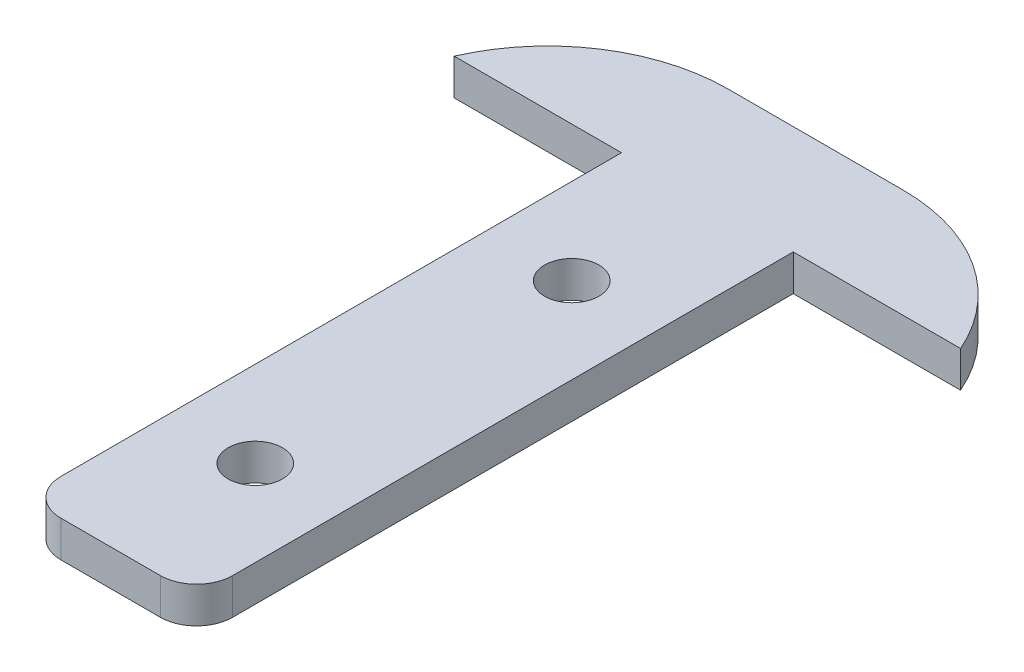
ISO-10303-21;
HEADER;
FILE_DESCRIPTION(('STEP AP214'),'2;1');
FILE_NAME('part.step','',(''),(''),'','','');
FILE_SCHEMA(('AUTOMOTIVE_DESIGN { 1 0 10303 214 1 1 1 1 }'));
ENDSEC;
DATA;
#1=APPLICATION_CONTEXT('core data for automotive mechanical design processes');
#2=APPLICATION_PROTOCOL_DEFINITION('international standard','automotive_design',2000,#1);
#3=PRODUCT_CONTEXT('',#1,'mechanical');
#4=PRODUCT('Part','Part','',(#3));
#5=PRODUCT_RELATED_PRODUCT_CATEGORY('part','',(#4));
#6=PRODUCT_DEFINITION_FORMATION('','',#4);
#7=PRODUCT_DEFINITION_CONTEXT('part definition',#1,'design');
#8=PRODUCT_DEFINITION('design','',#6,#7);
#9=PRODUCT_DEFINITION_SHAPE('','',#8);
#10=(LENGTH_UNIT() NAMED_UNIT(*) SI_UNIT(.MILLI.,.METRE.));
#11=(NAMED_UNIT(*) PLANE_ANGLE_UNIT() SI_UNIT($,.RADIAN.));
#12=(NAMED_UNIT(*) SI_UNIT($,.STERADIAN.) SOLID_ANGLE_UNIT());
#13=UNCERTAINTY_MEASURE_WITH_UNIT(LENGTH_MEASURE(1.E-05),#10,'distance_accuracy_value','');
#14=(GEOMETRIC_REPRESENTATION_CONTEXT(3) GLOBAL_UNCERTAINTY_ASSIGNED_CONTEXT((#13)) GLOBAL_UNIT_ASSIGNED_CONTEXT((#10,
#11,#12)) REPRESENTATION_CONTEXT('',''));
#15=CARTESIAN_POINT('',(0.,0.,0.));
#16=DIRECTION('',(0.,0.,1.));
#17=DIRECTION('',(1.,0.,0.));
#18=AXIS2_PLACEMENT_3D('',#15,#16,#17);
#19=CARTESIAN_POINT('',(0.,2.,-16.5));
#20=DIRECTION('',(0.,0.,-1.));
#21=DIRECTION('',(-1.,0.,0.));
#22=AXIS2_PLACEMENT_3D('',#19,#20,#21);
#23=PLANE('',#22);
#24=DIRECTION('',(1.,0.,0.));
#25=VECTOR('',#24,1.);
#26=CARTESIAN_POINT('',(0.,0.,-16.5));
#27=LINE('',#26,#25);
#28=CARTESIAN_POINT('',(-14.,0.,-16.5));
#29=VERTEX_POINT('',#28);
#30=CARTESIAN_POINT('',(-4.75,0.,-16.5));
#31=VERTEX_POINT('',#30);
#32=EDGE_CURVE('E140',#29,#31,#27,.T.);
#33=ORIENTED_EDGE('',*,*,#32,.T.);
#34=DIRECTION('',(0.,-1.,0.));
#35=VECTOR('',#34,1.);
#36=CARTESIAN_POINT('',(-4.75,2.,-16.5));
#37=LINE('',#36,#35);
#38=CARTESIAN_POINT('',(-4.75,2.,-16.5));
#39=VERTEX_POINT('',#38);
#40=EDGE_CURVE('E121',#39,#31,#37,.T.);
#41=ORIENTED_EDGE('',*,*,#40,.F.);
#42=DIRECTION('',(1.,0.,0.));
#43=VECTOR('',#42,1.);
#44=CARTESIAN_POINT('',(0.,2.,-16.5));
#45=LINE('',#44,#43);
#46=CARTESIAN_POINT('',(-14.,2.,-16.5));
#47=VERTEX_POINT('',#46);
#48=EDGE_CURVE('E125',#47,#39,#45,.T.);
#49=ORIENTED_EDGE('',*,*,#48,.F.);
#50=DIRECTION('',(0.,-1.,0.));
#51=VECTOR('',#50,1.);
#52=CARTESIAN_POINT('',(-14.,2.,-16.5));
#53=LINE('',#52,#51);
#54=EDGE_CURVE('E224',#47,#29,#53,.T.);
#55=ORIENTED_EDGE('',*,*,#54,.T.);
#56=EDGE_LOOP('',(#33,#41,#49,#55));
#57=FACE_BOUND('',#56,.T.);
#58=ADVANCED_FACE('F41',(#57),#23,.F.);
#59=CARTESIAN_POINT('',(-4.75,2.,0.));
#60=DIRECTION('',(-1.,0.,0.));
#61=DIRECTION('',(0.,0.,1.));
#62=AXIS2_PLACEMENT_3D('',#59,#60,#61);
#63=PLANE('',#62);
#64=DIRECTION('',(0.,0.,-1.));
#65=VECTOR('',#64,1.);
#66=CARTESIAN_POINT('',(-4.75,0.,0.));
#67=LINE('',#66,#65);
#68=CARTESIAN_POINT('',(-4.75,0.,14.5));
#69=VERTEX_POINT('',#68);
#70=EDGE_CURVE('E213',#69,#31,#67,.T.);
#71=ORIENTED_EDGE('',*,*,#70,.F.);
#72=DIRECTION('',(0.,-1.,0.));
#73=VECTOR('',#72,1.);
#74=CARTESIAN_POINT('',(-4.75,2.,14.5));
#75=LINE('',#74,#73);
#76=CARTESIAN_POINT('',(-4.75,2.,14.5));
#77=VERTEX_POINT('',#76);
#78=EDGE_CURVE('E11',#69,#77,#75,.F.);
#79=ORIENTED_EDGE('',*,*,#78,.T.);
#80=DIRECTION('',(0.,0.,-1.));
#81=VECTOR('',#80,1.);
#82=CARTESIAN_POINT('',(-4.75,2.,0.));
#83=LINE('',#82,#81);
#84=EDGE_CURVE('E117',#77,#39,#83,.T.);
#85=ORIENTED_EDGE('',*,*,#84,.T.);
#86=ORIENTED_EDGE('',*,*,#40,.T.);
#87=EDGE_LOOP('',(#71,#79,#85,#86));
#88=FACE_BOUND('',#87,.T.);
#89=ADVANCED_FACE('F119',(#88),#63,.T.);
#90=CARTESIAN_POINT('',(0.,2.,16.5));
#91=DIRECTION('',(0.,0.,1.));
#92=DIRECTION('',(1.,0.,0.));
#93=AXIS2_PLACEMENT_3D('',#90,#91,#92);
#94=PLANE('',#93);
#95=DIRECTION('',(-1.,0.,0.));
#96=VECTOR('',#95,1.);
#97=CARTESIAN_POINT('',(0.,0.,16.5));
#98=LINE('',#97,#96);
#99=CARTESIAN_POINT('',(2.75,0.,16.5));
#100=VERTEX_POINT('',#99);
#101=CARTESIAN_POINT('',(-2.75,0.,16.5));
#102=VERTEX_POINT('',#101);
#103=EDGE_CURVE('E206',#100,#102,#98,.T.);
#104=ORIENTED_EDGE('',*,*,#103,.F.);
#105=DIRECTION('',(0.,-1.,0.));
#106=VECTOR('',#105,1.);
#107=CARTESIAN_POINT('',(2.75,2.,16.5));
#108=LINE('',#107,#106);
#109=CARTESIAN_POINT('',(2.75,2.,16.5));
#110=VERTEX_POINT('',#109);
#111=EDGE_CURVE('E183',#100,#110,#108,.F.);
#112=ORIENTED_EDGE('',*,*,#111,.T.);
#113=DIRECTION('',(-1.,0.,0.));
#114=VECTOR('',#113,1.);
#115=CARTESIAN_POINT('',(0.,2.,16.5));
#116=LINE('',#115,#114);
#117=CARTESIAN_POINT('',(-2.75,2.,16.5));
#118=VERTEX_POINT('',#117);
#119=EDGE_CURVE('E124',#110,#118,#116,.T.);
#120=ORIENTED_EDGE('',*,*,#119,.T.);
#121=DIRECTION('',(0.,-1.,0.));
#122=VECTOR('',#121,1.);
#123=CARTESIAN_POINT('',(-2.75,2.,16.5));
#124=LINE('',#123,#122);
#125=EDGE_CURVE('E179',#118,#102,#124,.T.);
#126=ORIENTED_EDGE('',*,*,#125,.T.);
#127=EDGE_LOOP('',(#104,#112,#120,#126));
#128=FACE_BOUND('',#127,.T.);
#129=ADVANCED_FACE('F210',(#128),#94,.T.);
#130=CARTESIAN_POINT('',(4.75,2.,0.));
#131=DIRECTION('',(-1.,0.,0.));
#132=DIRECTION('',(0.,0.,1.));
#133=AXIS2_PLACEMENT_3D('',#130,#131,#132);
#134=PLANE('',#133);
#135=DIRECTION('',(0.,0.,-1.));
#136=VECTOR('',#135,1.);
#137=CARTESIAN_POINT('',(4.75,2.,0.));
#138=LINE('',#137,#136);
#139=CARTESIAN_POINT('',(4.75,2.,14.5));
#140=VERTEX_POINT('',#139);
#141=CARTESIAN_POINT('',(4.75,2.,-16.5));
#142=VERTEX_POINT('',#141);
#143=EDGE_CURVE('E190',#140,#142,#138,.T.);
#144=ORIENTED_EDGE('',*,*,#143,.F.);
#145=DIRECTION('',(0.,-1.,0.));
#146=VECTOR('',#145,1.);
#147=CARTESIAN_POINT('',(4.75,0.,14.5));
#148=LINE('',#147,#146);
#149=CARTESIAN_POINT('',(4.75,0.,14.5));
#150=VERTEX_POINT('',#149);
#151=EDGE_CURVE('E169',#140,#150,#148,.T.);
#152=ORIENTED_EDGE('',*,*,#151,.T.);
#153=DIRECTION('',(0.,0.,-1.));
#154=VECTOR('',#153,1.);
#155=CARTESIAN_POINT('',(4.75,0.,0.));
#156=LINE('',#155,#154);
#157=CARTESIAN_POINT('',(4.75,0.,-16.5));
#158=VERTEX_POINT('',#157);
#159=EDGE_CURVE('E208',#150,#158,#156,.T.);
#160=ORIENTED_EDGE('',*,*,#159,.T.);
#161=DIRECTION('',(0.,-1.,0.));
#162=VECTOR('',#161,1.);
#163=CARTESIAN_POINT('',(4.75,2.,-16.5));
#164=LINE('',#163,#162);
#165=EDGE_CURVE('E143',#142,#158,#164,.T.);
#166=ORIENTED_EDGE('',*,*,#165,.F.);
#167=EDGE_LOOP('',(#144,#152,#160,#166));
#168=FACE_BOUND('',#167,.T.);
#169=ADVANCED_FACE('F196',(#168),#134,.F.);
#170=CARTESIAN_POINT('',(14.,0.,-16.5));
#171=VERTEX_POINT('',#170);
#172=EDGE_CURVE('E217',#158,#171,#27,.T.);
#173=ORIENTED_EDGE('',*,*,#172,.T.);
#174=DIRECTION('',(0.,-1.,0.));
#175=VECTOR('',#174,1.);
#176=CARTESIAN_POINT('',(14.,2.,-16.5));
#177=LINE('',#176,#175);
#178=CARTESIAN_POINT('',(14.,2.,-16.5));
#179=VERTEX_POINT('',#178);
#180=EDGE_CURVE('E151',#179,#171,#177,.T.);
#181=ORIENTED_EDGE('',*,*,#180,.F.);
#182=EDGE_CURVE('E138',#142,#179,#45,.T.);
#183=ORIENTED_EDGE('',*,*,#182,.F.);
#184=ORIENTED_EDGE('',*,*,#165,.T.);
#185=EDGE_LOOP('',(#173,#181,#183,#184));
#186=FACE_BOUND('',#185,.T.);
#187=ADVANCED_FACE('F237',(#186),#23,.F.);
#188=CARTESIAN_POINT('',(0.,2.,-22.5));
#189=DIRECTION('',(0.,0.,-1.));
#190=DIRECTION('',(-1.,0.,0.));
#191=AXIS2_PLACEMENT_3D('',#188,#189,#190);
#192=PLANE('',#191);
#193=DIRECTION('',(1.,0.,0.));
#194=VECTOR('',#193,1.);
#195=CARTESIAN_POINT('',(0.,0.,-22.5));
#196=LINE('',#195,#194);
#197=CARTESIAN_POINT('',(-4.83484861008832,0.,-22.5));
#198=VERTEX_POINT('',#197);
#199=CARTESIAN_POINT('',(4.83484861008832,0.,-22.5));
#200=VERTEX_POINT('',#199);
#201=EDGE_CURVE('E136',#198,#200,#196,.T.);
#202=ORIENTED_EDGE('',*,*,#201,.F.);
#203=DIRECTION('',(0.,1.,0.));
#204=VECTOR('',#203,1.);
#205=CARTESIAN_POINT('',(-4.83484861008832,2.,-22.5));
#206=LINE('',#205,#204);
#207=CARTESIAN_POINT('',(-4.83484861008832,2.,-22.5));
#208=VERTEX_POINT('',#207);
#209=EDGE_CURVE('E164',#198,#208,#206,.T.);
#210=ORIENTED_EDGE('',*,*,#209,.T.);
#211=DIRECTION('',(1.,0.,0.));
#212=VECTOR('',#211,1.);
#213=CARTESIAN_POINT('',(0.,2.,-22.5));
#214=LINE('',#213,#212);
#215=CARTESIAN_POINT('',(4.83484861008832,2.,-22.5));
#216=VERTEX_POINT('',#215);
#217=EDGE_CURVE('E226',#208,#216,#214,.T.);
#218=ORIENTED_EDGE('',*,*,#217,.T.);
#219=DIRECTION('',(0.,1.,0.));
#220=VECTOR('',#219,1.);
#221=CARTESIAN_POINT('',(4.83484861008832,0.,-22.5));
#222=LINE('',#221,#220);
#223=EDGE_CURVE('E142',#216,#200,#222,.F.);
#224=ORIENTED_EDGE('',*,*,#223,.T.);
#225=EDGE_LOOP('',(#202,#210,#218,#224));
#226=FACE_BOUND('',#225,.T.);
#227=ADVANCED_FACE('F265',(#226),#192,.T.);
#228=CARTESIAN_POINT('',(0.,2.,0.));
#229=DIRECTION('',(0.,1.,0.));
#230=DIRECTION('',(0.,0.,1.));
#231=AXIS2_PLACEMENT_3D('',#228,#229,#230);
#232=PLANE('',#231);
#233=CARTESIAN_POINT('',(0.,2.,8.49999999999999));
#234=DIRECTION('',(0.,-1.,0.));
#235=DIRECTION('',(0.,0.,-1.));
#236=AXIS2_PLACEMENT_3D('',#233,#234,#235);
#237=CIRCLE('',#236,1.5);
#238=CARTESIAN_POINT('',(0.,2.,6.99999999999999));
#239=VERTEX_POINT('',#238);
#240=EDGE_CURVE('E241',#239,#239,#237,.T.);
#241=ORIENTED_EDGE('',*,*,#240,.T.);
#242=EDGE_LOOP('',(#241));
#243=FACE_BOUND('',#242,.T.);
#244=CARTESIAN_POINT('',(0.,2.,-9.00000000000001));
#245=DIRECTION('',(0.,-1.,0.));
#246=DIRECTION('',(0.,0.,-1.));
#247=AXIS2_PLACEMENT_3D('',#244,#245,#246);
#248=CIRCLE('',#247,1.5);
#249=CARTESIAN_POINT('',(0.,2.,-10.5));
#250=VERTEX_POINT('',#249);
#251=EDGE_CURVE('E250',#250,#250,#248,.T.);
#252=ORIENTED_EDGE('',*,*,#251,.T.);
#253=EDGE_LOOP('',(#252));
#254=FACE_BOUND('',#253,.T.);
#255=ORIENTED_EDGE('',*,*,#119,.F.);
#256=CARTESIAN_POINT('',(2.75,2.,14.5));
#257=DIRECTION('',(0.,1.,0.));
#258=DIRECTION('',(0.,0.,1.));
#259=AXIS2_PLACEMENT_3D('',#256,#257,#258);
#260=CIRCLE('',#259,2.);
#261=EDGE_CURVE('E50',#110,#140,#260,.T.);
#262=ORIENTED_EDGE('',*,*,#261,.T.);
#263=ORIENTED_EDGE('',*,*,#143,.T.);
#264=ORIENTED_EDGE('',*,*,#182,.T.);
#265=CARTESIAN_POINT('',(4.83484861008832,2.,-12.5));
#266=DIRECTION('',(0.,1.,0.));
#267=DIRECTION('',(0.,0.,1.));
#268=AXIS2_PLACEMENT_3D('',#265,#266,#267);
#269=CIRCLE('',#268,10.);
#270=EDGE_CURVE('E157',#179,#216,#269,.T.);
#271=ORIENTED_EDGE('',*,*,#270,.T.);
#272=ORIENTED_EDGE('',*,*,#217,.F.);
#273=CARTESIAN_POINT('',(-4.83484861008832,2.,-12.5));
#274=DIRECTION('',(0.,1.,0.));
#275=DIRECTION('',(0.,0.,1.));
#276=AXIS2_PLACEMENT_3D('',#273,#274,#275);
#277=CIRCLE('',#276,10.);
#278=EDGE_CURVE('E131',#208,#47,#277,.T.);
#279=ORIENTED_EDGE('',*,*,#278,.T.);
#280=ORIENTED_EDGE('',*,*,#48,.T.);
#281=ORIENTED_EDGE('',*,*,#84,.F.);
#282=CARTESIAN_POINT('',(-2.75,2.,14.5));
#283=DIRECTION('',(0.,1.,0.));
#284=DIRECTION('',(0.,0.,1.));
#285=AXIS2_PLACEMENT_3D('',#282,#283,#284);
#286=CIRCLE('',#285,2.);
#287=EDGE_CURVE('E62',#77,#118,#286,.T.);
#288=ORIENTED_EDGE('',*,*,#287,.T.);
#289=EDGE_LOOP('',(#255,#262,#263,#264,#271,#272,#279,#280,#281,#288));
#290=FACE_BOUND('',#289,.T.);
#291=ADVANCED_FACE('F128',(#243,#254,#290),#232,.T.);
#292=CARTESIAN_POINT('',(0.,0.,0.));
#293=DIRECTION('',(0.,1.,0.));
#294=DIRECTION('',(0.,0.,1.));
#295=AXIS2_PLACEMENT_3D('',#292,#293,#294);
#296=PLANE('',#295);
#297=CARTESIAN_POINT('',(0.,0.,8.49999999999999));
#298=DIRECTION('',(0.,-1.,0.));
#299=DIRECTION('',(0.,0.,-1.));
#300=AXIS2_PLACEMENT_3D('',#297,#298,#299);
#301=CIRCLE('',#300,1.5);
#302=CARTESIAN_POINT('',(0.,0.,6.99999999999999));
#303=VERTEX_POINT('',#302);
#304=EDGE_CURVE('E244',#303,#303,#301,.T.);
#305=ORIENTED_EDGE('',*,*,#304,.F.);
#306=EDGE_LOOP('',(#305));
#307=FACE_BOUND('',#306,.T.);
#308=CARTESIAN_POINT('',(0.,0.,-9.00000000000001));
#309=DIRECTION('',(0.,-1.,0.));
#310=DIRECTION('',(0.,0.,-1.));
#311=AXIS2_PLACEMENT_3D('',#308,#309,#310);
#312=CIRCLE('',#311,1.5);
#313=CARTESIAN_POINT('',(0.,0.,-10.5));
#314=VERTEX_POINT('',#313);
#315=EDGE_CURVE('E256',#314,#314,#312,.T.);
#316=ORIENTED_EDGE('',*,*,#315,.F.);
#317=EDGE_LOOP('',(#316));
#318=FACE_BOUND('',#317,.T.);
#319=ORIENTED_EDGE('',*,*,#159,.F.);
#320=CARTESIAN_POINT('',(2.75,0.,14.5));
#321=DIRECTION('',(0.,1.,0.));
#322=DIRECTION('',(0.,0.,1.));
#323=AXIS2_PLACEMENT_3D('',#320,#321,#322);
#324=CIRCLE('',#323,2.);
#325=EDGE_CURVE('E176',#150,#100,#324,.F.);
#326=ORIENTED_EDGE('',*,*,#325,.T.);
#327=ORIENTED_EDGE('',*,*,#103,.T.);
#328=CARTESIAN_POINT('',(-2.75,0.,14.5));
#329=DIRECTION('',(0.,1.,0.));
#330=DIRECTION('',(0.,0.,1.));
#331=AXIS2_PLACEMENT_3D('',#328,#329,#330);
#332=CIRCLE('',#331,2.);
#333=EDGE_CURVE('E173',#102,#69,#332,.F.);
#334=ORIENTED_EDGE('',*,*,#333,.T.);
#335=ORIENTED_EDGE('',*,*,#70,.T.);
#336=ORIENTED_EDGE('',*,*,#32,.F.);
#337=CARTESIAN_POINT('',(-4.83484861008832,0.,-12.5));
#338=DIRECTION('',(0.,1.,0.));
#339=DIRECTION('',(0.,0.,1.));
#340=AXIS2_PLACEMENT_3D('',#337,#338,#339);
#341=CIRCLE('',#340,10.);
#342=EDGE_CURVE('E161',#29,#198,#341,.F.);
#343=ORIENTED_EDGE('',*,*,#342,.T.);
#344=ORIENTED_EDGE('',*,*,#201,.T.);
#345=CARTESIAN_POINT('',(4.83484861008832,0.,-12.5));
#346=DIRECTION('',(0.,1.,0.));
#347=DIRECTION('',(0.,0.,1.));
#348=AXIS2_PLACEMENT_3D('',#345,#346,#347);
#349=CIRCLE('',#348,10.);
#350=EDGE_CURVE('E148',#200,#171,#349,.F.);
#351=ORIENTED_EDGE('',*,*,#350,.T.);
#352=ORIENTED_EDGE('',*,*,#172,.F.);
#353=EDGE_LOOP('',(#319,#326,#327,#334,#335,#336,#343,#344,#351,#352));
#354=FACE_BOUND('',#353,.T.);
#355=ADVANCED_FACE('F205',(#307,#318,#354),#296,.F.);
#356=CARTESIAN_POINT('',(0.,2.,-9.00000000000001));
#357=DIRECTION('',(0.,-1.,0.));
#358=DIRECTION('',(0.,0.,-1.));
#359=AXIS2_PLACEMENT_3D('',#356,#357,#358);
#360=CYLINDRICAL_SURFACE('',#359,1.5);
#361=ORIENTED_EDGE('',*,*,#251,.F.);
#362=EDGE_LOOP('',(#361));
#363=FACE_BOUND('',#362,.T.);
#364=ORIENTED_EDGE('',*,*,#315,.T.);
#365=EDGE_LOOP('',(#364));
#366=FACE_BOUND('',#365,.T.);
#367=ADVANCED_FACE('F320',(#363,#366),#360,.F.);
#368=CARTESIAN_POINT('',(0.,2.,8.49999999999999));
#369=DIRECTION('',(0.,-1.,0.));
#370=DIRECTION('',(0.,0.,-1.));
#371=AXIS2_PLACEMENT_3D('',#368,#369,#370);
#372=CYLINDRICAL_SURFACE('',#371,1.5);
#373=ORIENTED_EDGE('',*,*,#240,.F.);
#374=EDGE_LOOP('',(#373));
#375=FACE_BOUND('',#374,.T.);
#376=ORIENTED_EDGE('',*,*,#304,.T.);
#377=EDGE_LOOP('',(#376));
#378=FACE_BOUND('',#377,.T.);
#379=ADVANCED_FACE('F294',(#375,#378),#372,.F.);
#380=CARTESIAN_POINT('',(4.83484861008832,2.,-12.5));
#381=DIRECTION('',(0.,-1.,0.));
#382=DIRECTION('',(0.,0.,-1.));
#383=AXIS2_PLACEMENT_3D('',#380,#381,#382);
#384=CYLINDRICAL_SURFACE('',#383,10.);
#385=ORIENTED_EDGE('',*,*,#270,.F.);
#386=ORIENTED_EDGE('',*,*,#180,.T.);
#387=ORIENTED_EDGE('',*,*,#350,.F.);
#388=ORIENTED_EDGE('',*,*,#223,.F.);
#389=EDGE_LOOP('',(#385,#386,#387,#388));
#390=FACE_BOUND('',#389,.T.);
#391=ADVANCED_FACE('F233',(#390),#384,.T.);
#392=CARTESIAN_POINT('',(-4.83484861008832,2.,-12.5));
#393=DIRECTION('',(0.,-1.,0.));
#394=DIRECTION('',(0.,0.,-1.));
#395=AXIS2_PLACEMENT_3D('',#392,#393,#394);
#396=CYLINDRICAL_SURFACE('',#395,10.);
#397=ORIENTED_EDGE('',*,*,#278,.F.);
#398=ORIENTED_EDGE('',*,*,#209,.F.);
#399=ORIENTED_EDGE('',*,*,#342,.F.);
#400=ORIENTED_EDGE('',*,*,#54,.F.);
#401=EDGE_LOOP('',(#397,#398,#399,#400));
#402=FACE_BOUND('',#401,.T.);
#403=ADVANCED_FACE('F268',(#402),#396,.T.);
#404=CARTESIAN_POINT('',(2.75,2.,14.5));
#405=DIRECTION('',(0.,1.,0.));
#406=DIRECTION('',(0.,0.,1.));
#407=AXIS2_PLACEMENT_3D('',#404,#405,#406);
#408=CYLINDRICAL_SURFACE('',#407,2.);
#409=ORIENTED_EDGE('',*,*,#261,.F.);
#410=ORIENTED_EDGE('',*,*,#111,.F.);
#411=ORIENTED_EDGE('',*,*,#325,.F.);
#412=ORIENTED_EDGE('',*,*,#151,.F.);
#413=EDGE_LOOP('',(#409,#410,#411,#412));
#414=FACE_BOUND('',#413,.T.);
#415=ADVANCED_FACE('F201',(#414),#408,.T.);
#416=CARTESIAN_POINT('',(-2.75,2.,14.5));
#417=DIRECTION('',(0.,-1.,0.));
#418=DIRECTION('',(0.,0.,-1.));
#419=AXIS2_PLACEMENT_3D('',#416,#417,#418);
#420=CYLINDRICAL_SURFACE('',#419,2.);
#421=ORIENTED_EDGE('',*,*,#287,.F.);
#422=ORIENTED_EDGE('',*,*,#78,.F.);
#423=ORIENTED_EDGE('',*,*,#333,.F.);
#424=ORIENTED_EDGE('',*,*,#125,.F.);
#425=EDGE_LOOP('',(#421,#422,#423,#424));
#426=FACE_BOUND('',#425,.T.);
#427=ADVANCED_FACE('F43',(#426),#420,.T.);
#428=CLOSED_SHELL('',(#58,#89,#129,#169,#187,#227,#291,#355,#367,#379,#391,#403,#415,#427));
#429=MANIFOLD_SOLID_BREP('B2',#428);
#430=ADVANCED_BREP_SHAPE_REPRESENTATION('',(#18,#429),#14);
#431=SHAPE_DEFINITION_REPRESENTATION(#9,#430);
ENDSEC;
END-ISO-10303-21;
